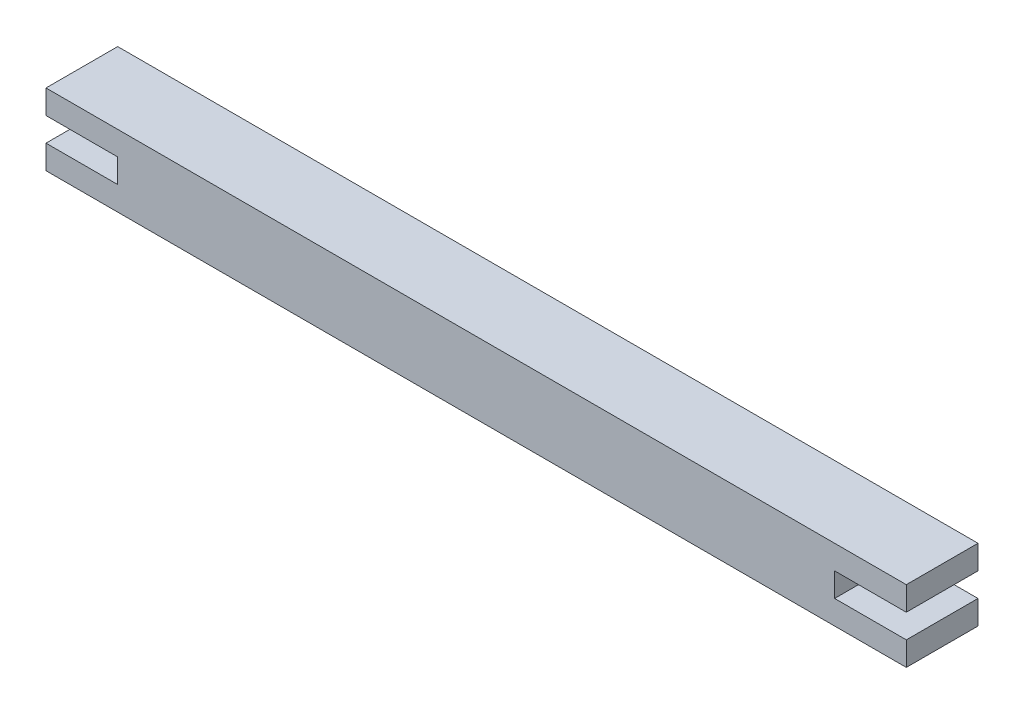
ISO-10303-21;
HEADER;
FILE_DESCRIPTION(('STEP AP214'),'2;1');
FILE_NAME('part.step','',(''),(''),'','','');
FILE_SCHEMA(('AUTOMOTIVE_DESIGN { 1 0 10303 214 1 1 1 1 }'));
ENDSEC;
DATA;
#1=APPLICATION_CONTEXT('core data for automotive mechanical design processes');
#2=APPLICATION_PROTOCOL_DEFINITION('international standard','automotive_design',2000,#1);
#3=PRODUCT_CONTEXT('',#1,'mechanical');
#4=PRODUCT('Part','Part','',(#3));
#5=PRODUCT_RELATED_PRODUCT_CATEGORY('part','',(#4));
#6=PRODUCT_DEFINITION_FORMATION('','',#4);
#7=PRODUCT_DEFINITION_CONTEXT('part definition',#1,'design');
#8=PRODUCT_DEFINITION('design','',#6,#7);
#9=PRODUCT_DEFINITION_SHAPE('','',#8);
#10=(LENGTH_UNIT() NAMED_UNIT(*) SI_UNIT(.MILLI.,.METRE.));
#11=(NAMED_UNIT(*) PLANE_ANGLE_UNIT() SI_UNIT($,.RADIAN.));
#12=(NAMED_UNIT(*) SI_UNIT($,.STERADIAN.) SOLID_ANGLE_UNIT());
#13=UNCERTAINTY_MEASURE_WITH_UNIT(LENGTH_MEASURE(1.E-05),#10,'distance_accuracy_value','');
#14=(GEOMETRIC_REPRESENTATION_CONTEXT(3) GLOBAL_UNCERTAINTY_ASSIGNED_CONTEXT((#13)) GLOBAL_UNIT_ASSIGNED_CONTEXT((#10,
#11,#12)) REPRESENTATION_CONTEXT('',''));
#15=CARTESIAN_POINT('',(0.,0.,0.));
#16=DIRECTION('',(0.,0.,1.));
#17=DIRECTION('',(1.,0.,0.));
#18=AXIS2_PLACEMENT_3D('',#15,#16,#17);
#19=CARTESIAN_POINT('',(150.,15.,-200.));
#20=DIRECTION('',(-1.,0.,0.));
#21=DIRECTION('',(0.,0.,1.));
#22=AXIS2_PLACEMENT_3D('',#19,#20,#21);
#23=PLANE('',#22);
#24=DIRECTION('',(0.,-1.,0.));
#25=VECTOR('',#24,1.);
#26=CARTESIAN_POINT('',(150.,15.,-200.));
#27=LINE('',#26,#25);
#28=CARTESIAN_POINT('',(150.,5.,-200.));
#29=VERTEX_POINT('',#28);
#30=CARTESIAN_POINT('',(150.,-5.,-200.));
#31=VERTEX_POINT('',#30);
#32=EDGE_CURVE('E207',#29,#31,#27,.T.);
#33=ORIENTED_EDGE('',*,*,#32,.T.);
#34=DIRECTION('',(0.,0.,-1.));
#35=VECTOR('',#34,1.);
#36=CARTESIAN_POINT('',(150.,-5.,-200.));
#37=LINE('',#36,#35);
#38=CARTESIAN_POINT('',(150.,-5.,-230.));
#39=VERTEX_POINT('',#38);
#40=EDGE_CURVE('E165',#31,#39,#37,.T.);
#41=ORIENTED_EDGE('',*,*,#40,.T.);
#42=DIRECTION('',(0.,-1.,0.));
#43=VECTOR('',#42,1.);
#44=CARTESIAN_POINT('',(150.,15.,-230.));
#45=LINE('',#44,#43);
#46=CARTESIAN_POINT('',(150.,5.,-230.));
#47=VERTEX_POINT('',#46);
#48=EDGE_CURVE('E11',#47,#39,#45,.T.);
#49=ORIENTED_EDGE('',*,*,#48,.F.);
#50=DIRECTION('',(0.,0.,1.));
#51=VECTOR('',#50,1.);
#52=CARTESIAN_POINT('',(150.,5.,-200.));
#53=LINE('',#52,#51);
#54=EDGE_CURVE('E201',#47,#29,#53,.T.);
#55=ORIENTED_EDGE('',*,*,#54,.T.);
#56=EDGE_LOOP('',(#33,#41,#49,#55));
#57=FACE_BOUND('',#56,.T.);
#58=ADVANCED_FACE('F33',(#57),#23,.F.);
#59=CARTESIAN_POINT('',(-150.,15.,-230.));
#60=DIRECTION('',(0.,0.,1.));
#61=DIRECTION('',(1.,0.,0.));
#62=AXIS2_PLACEMENT_3D('',#59,#60,#61);
#63=PLANE('',#62);
#64=ORIENTED_EDGE('',*,*,#48,.T.);
#65=DIRECTION('',(-1.,0.,0.));
#66=VECTOR('',#65,1.);
#67=CARTESIAN_POINT('',(-180.,-5.,-230.));
#68=LINE('',#67,#66);
#69=CARTESIAN_POINT('',(180.,-5.,-230.));
#70=VERTEX_POINT('',#69);
#71=EDGE_CURVE('E47',#70,#39,#68,.T.);
#72=ORIENTED_EDGE('',*,*,#71,.F.);
#73=DIRECTION('',(0.,1.,0.));
#74=VECTOR('',#73,1.);
#75=CARTESIAN_POINT('',(180.,-15.,-230.));
#76=LINE('',#75,#74);
#77=CARTESIAN_POINT('',(180.,-15.,-230.));
#78=VERTEX_POINT('',#77);
#79=EDGE_CURVE('E149',#78,#70,#76,.T.);
#80=ORIENTED_EDGE('',*,*,#79,.F.);
#81=DIRECTION('',(-1.,0.,0.));
#82=VECTOR('',#81,1.);
#83=CARTESIAN_POINT('',(-150.,-15.,-230.));
#84=LINE('',#83,#82);
#85=CARTESIAN_POINT('',(-180.,-15.,-230.));
#86=VERTEX_POINT('',#85);
#87=EDGE_CURVE('E136',#78,#86,#84,.T.);
#88=ORIENTED_EDGE('',*,*,#87,.T.);
#89=DIRECTION('',(0.,1.,0.));
#90=VECTOR('',#89,1.);
#91=CARTESIAN_POINT('',(-180.,-15.,-230.));
#92=LINE('',#91,#90);
#93=CARTESIAN_POINT('',(-180.,-5.,-230.));
#94=VERTEX_POINT('',#93);
#95=EDGE_CURVE('E160',#86,#94,#92,.T.);
#96=ORIENTED_EDGE('',*,*,#95,.T.);
#97=CARTESIAN_POINT('',(-150.,-5.,-230.));
#98=VERTEX_POINT('',#97);
#99=EDGE_CURVE('E151',#98,#94,#68,.T.);
#100=ORIENTED_EDGE('',*,*,#99,.F.);
#101=DIRECTION('',(0.,-1.,0.));
#102=VECTOR('',#101,1.);
#103=CARTESIAN_POINT('',(-150.,15.,-230.));
#104=LINE('',#103,#102);
#105=CARTESIAN_POINT('',(-150.,5.,-230.));
#106=VERTEX_POINT('',#105);
#107=EDGE_CURVE('E40',#106,#98,#104,.T.);
#108=ORIENTED_EDGE('',*,*,#107,.F.);
#109=DIRECTION('',(-1.,0.,0.));
#110=VECTOR('',#109,1.);
#111=CARTESIAN_POINT('',(-180.,5.,-230.));
#112=LINE('',#111,#110);
#113=CARTESIAN_POINT('',(-180.,5.,-230.));
#114=VERTEX_POINT('',#113);
#115=EDGE_CURVE('E178',#106,#114,#112,.T.);
#116=ORIENTED_EDGE('',*,*,#115,.T.);
#117=DIRECTION('',(0.,-1.,0.));
#118=VECTOR('',#117,1.);
#119=CARTESIAN_POINT('',(-180.,15.,-230.));
#120=LINE('',#119,#118);
#121=CARTESIAN_POINT('',(-180.,15.,-230.));
#122=VERTEX_POINT('',#121);
#123=EDGE_CURVE('E192',#122,#114,#120,.T.);
#124=ORIENTED_EDGE('',*,*,#123,.F.);
#125=DIRECTION('',(-1.,0.,0.));
#126=VECTOR('',#125,1.);
#127=CARTESIAN_POINT('',(-150.,15.,-230.));
#128=LINE('',#127,#126);
#129=CARTESIAN_POINT('',(180.,15.,-230.));
#130=VERTEX_POINT('',#129);
#131=EDGE_CURVE('E135',#130,#122,#128,.T.);
#132=ORIENTED_EDGE('',*,*,#131,.F.);
#133=DIRECTION('',(0.,-1.,0.));
#134=VECTOR('',#133,1.);
#135=CARTESIAN_POINT('',(180.,15.,-230.));
#136=LINE('',#135,#134);
#137=CARTESIAN_POINT('',(180.,5.,-230.));
#138=VERTEX_POINT('',#137);
#139=EDGE_CURVE('E195',#130,#138,#136,.T.);
#140=ORIENTED_EDGE('',*,*,#139,.T.);
#141=EDGE_CURVE('E179',#138,#47,#112,.T.);
#142=ORIENTED_EDGE('',*,*,#141,.T.);
#143=EDGE_LOOP('',(#64,#72,#80,#88,#96,#100,#108,#116,#124,#132,#140,#142));
#144=FACE_BOUND('',#143,.T.);
#145=ADVANCED_FACE('F219',(#144),#63,.F.);
#146=CARTESIAN_POINT('',(-150.,15.,-200.));
#147=DIRECTION('',(1.,0.,0.));
#148=DIRECTION('',(0.,0.,-1.));
#149=AXIS2_PLACEMENT_3D('',#146,#147,#148);
#150=PLANE('',#149);
#151=ORIENTED_EDGE('',*,*,#107,.T.);
#152=DIRECTION('',(0.,0.,1.));
#153=VECTOR('',#152,1.);
#154=CARTESIAN_POINT('',(-150.,-5.,-200.));
#155=LINE('',#154,#153);
#156=CARTESIAN_POINT('',(-150.,-5.,-200.));
#157=VERTEX_POINT('',#156);
#158=EDGE_CURVE('E143',#98,#157,#155,.T.);
#159=ORIENTED_EDGE('',*,*,#158,.T.);
#160=DIRECTION('',(0.,-1.,0.));
#161=VECTOR('',#160,1.);
#162=CARTESIAN_POINT('',(-150.,15.,-200.));
#163=LINE('',#162,#161);
#164=CARTESIAN_POINT('',(-150.,5.,-200.));
#165=VERTEX_POINT('',#164);
#166=EDGE_CURVE('E211',#165,#157,#163,.T.);
#167=ORIENTED_EDGE('',*,*,#166,.F.);
#168=DIRECTION('',(0.,0.,-1.));
#169=VECTOR('',#168,1.);
#170=CARTESIAN_POINT('',(-150.,5.,-200.));
#171=LINE('',#170,#169);
#172=EDGE_CURVE('E198',#165,#106,#171,.T.);
#173=ORIENTED_EDGE('',*,*,#172,.T.);
#174=EDGE_LOOP('',(#151,#159,#167,#173));
#175=FACE_BOUND('',#174,.T.);
#176=ADVANCED_FACE('F215',(#175),#150,.F.);
#177=CARTESIAN_POINT('',(-150.,15.,-200.));
#178=DIRECTION('',(0.,0.,-1.));
#179=DIRECTION('',(-1.,0.,0.));
#180=AXIS2_PLACEMENT_3D('',#177,#178,#179);
#181=PLANE('',#180);
#182=ORIENTED_EDGE('',*,*,#166,.T.);
#183=DIRECTION('',(1.,0.,0.));
#184=VECTOR('',#183,1.);
#185=CARTESIAN_POINT('',(-180.,-5.,-200.));
#186=LINE('',#185,#184);
#187=CARTESIAN_POINT('',(-180.,-5.,-200.));
#188=VERTEX_POINT('',#187);
#189=EDGE_CURVE('E55',#188,#157,#186,.T.);
#190=ORIENTED_EDGE('',*,*,#189,.F.);
#191=DIRECTION('',(0.,1.,0.));
#192=VECTOR('',#191,1.);
#193=CARTESIAN_POINT('',(-180.,-15.,-200.));
#194=LINE('',#193,#192);
#195=CARTESIAN_POINT('',(-180.,-15.,-200.));
#196=VERTEX_POINT('',#195);
#197=EDGE_CURVE('E130',#196,#188,#194,.T.);
#198=ORIENTED_EDGE('',*,*,#197,.F.);
#199=DIRECTION('',(1.,0.,0.));
#200=VECTOR('',#199,1.);
#201=CARTESIAN_POINT('',(-150.,-15.,-200.));
#202=LINE('',#201,#200);
#203=CARTESIAN_POINT('',(180.,-15.,-200.));
#204=VERTEX_POINT('',#203);
#205=EDGE_CURVE('E123',#196,#204,#202,.T.);
#206=ORIENTED_EDGE('',*,*,#205,.T.);
#207=DIRECTION('',(0.,1.,0.));
#208=VECTOR('',#207,1.);
#209=CARTESIAN_POINT('',(180.,-15.,-200.));
#210=LINE('',#209,#208);
#211=CARTESIAN_POINT('',(180.,-5.,-200.));
#212=VERTEX_POINT('',#211);
#213=EDGE_CURVE('E128',#204,#212,#210,.T.);
#214=ORIENTED_EDGE('',*,*,#213,.T.);
#215=EDGE_CURVE('E155',#31,#212,#186,.T.);
#216=ORIENTED_EDGE('',*,*,#215,.F.);
#217=ORIENTED_EDGE('',*,*,#32,.F.);
#218=DIRECTION('',(1.,0.,0.));
#219=VECTOR('',#218,1.);
#220=CARTESIAN_POINT('',(-180.,5.,-200.));
#221=LINE('',#220,#219);
#222=CARTESIAN_POINT('',(180.,5.,-200.));
#223=VERTEX_POINT('',#222);
#224=EDGE_CURVE('E184',#29,#223,#221,.T.);
#225=ORIENTED_EDGE('',*,*,#224,.T.);
#226=DIRECTION('',(0.,-1.,0.));
#227=VECTOR('',#226,1.);
#228=CARTESIAN_POINT('',(180.,15.,-200.));
#229=LINE('',#228,#227);
#230=CARTESIAN_POINT('',(180.,15.,-200.));
#231=VERTEX_POINT('',#230);
#232=EDGE_CURVE('E175',#231,#223,#229,.T.);
#233=ORIENTED_EDGE('',*,*,#232,.F.);
#234=DIRECTION('',(1.,0.,0.));
#235=VECTOR('',#234,1.);
#236=CARTESIAN_POINT('',(-150.,15.,-200.));
#237=LINE('',#236,#235);
#238=CARTESIAN_POINT('',(-180.,15.,-200.));
#239=VERTEX_POINT('',#238);
#240=EDGE_CURVE('E205',#239,#231,#237,.T.);
#241=ORIENTED_EDGE('',*,*,#240,.F.);
#242=DIRECTION('',(0.,-1.,0.));
#243=VECTOR('',#242,1.);
#244=CARTESIAN_POINT('',(-180.,15.,-200.));
#245=LINE('',#244,#243);
#246=CARTESIAN_POINT('',(-180.,5.,-200.));
#247=VERTEX_POINT('',#246);
#248=EDGE_CURVE('E189',#239,#247,#245,.T.);
#249=ORIENTED_EDGE('',*,*,#248,.T.);
#250=EDGE_CURVE('E172',#247,#165,#221,.T.);
#251=ORIENTED_EDGE('',*,*,#250,.T.);
#252=EDGE_LOOP('',(#182,#190,#198,#206,#214,#216,#217,#225,#233,#241,#249,#251));
#253=FACE_BOUND('',#252,.T.);
#254=ADVANCED_FACE('F126',(#253),#181,.F.);
#255=CARTESIAN_POINT('',(0.,15.,0.));
#256=DIRECTION('',(0.,-1.,0.));
#257=DIRECTION('',(0.,0.,-1.));
#258=AXIS2_PLACEMENT_3D('',#255,#256,#257);
#259=PLANE('',#258);
#260=ORIENTED_EDGE('',*,*,#240,.T.);
#261=DIRECTION('',(0.,0.,-1.));
#262=VECTOR('',#261,1.);
#263=CARTESIAN_POINT('',(180.,15.,-200.));
#264=LINE('',#263,#262);
#265=EDGE_CURVE('E168',#231,#130,#264,.T.);
#266=ORIENTED_EDGE('',*,*,#265,.T.);
#267=ORIENTED_EDGE('',*,*,#131,.T.);
#268=DIRECTION('',(0.,0.,1.));
#269=VECTOR('',#268,1.);
#270=CARTESIAN_POINT('',(-180.,15.,-200.));
#271=LINE('',#270,#269);
#272=EDGE_CURVE('E171',#122,#239,#271,.T.);
#273=ORIENTED_EDGE('',*,*,#272,.T.);
#274=EDGE_LOOP('',(#260,#266,#267,#273));
#275=FACE_BOUND('',#274,.T.);
#276=ADVANCED_FACE('F237',(#275),#259,.F.);
#277=CARTESIAN_POINT('',(0.,-15.,0.));
#278=DIRECTION('',(0.,-1.,0.));
#279=DIRECTION('',(0.,0.,-1.));
#280=AXIS2_PLACEMENT_3D('',#277,#278,#279);
#281=PLANE('',#280);
#282=ORIENTED_EDGE('',*,*,#87,.F.);
#283=DIRECTION('',(0.,0.,-1.));
#284=VECTOR('',#283,1.);
#285=CARTESIAN_POINT('',(180.,-15.,-200.));
#286=LINE('',#285,#284);
#287=EDGE_CURVE('E141',#204,#78,#286,.T.);
#288=ORIENTED_EDGE('',*,*,#287,.F.);
#289=ORIENTED_EDGE('',*,*,#205,.F.);
#290=DIRECTION('',(0.,0.,1.));
#291=VECTOR('',#290,1.);
#292=CARTESIAN_POINT('',(-180.,-15.,-200.));
#293=LINE('',#292,#291);
#294=EDGE_CURVE('E147',#86,#196,#293,.T.);
#295=ORIENTED_EDGE('',*,*,#294,.F.);
#296=EDGE_LOOP('',(#282,#288,#289,#295));
#297=FACE_BOUND('',#296,.T.);
#298=ADVANCED_FACE('F145',(#297),#281,.T.);
#299=CARTESIAN_POINT('',(-180.,15.,-200.));
#300=DIRECTION('',(1.,0.,0.));
#301=DIRECTION('',(0.,0.,-1.));
#302=AXIS2_PLACEMENT_3D('',#299,#300,#301);
#303=PLANE('',#302);
#304=DIRECTION('',(0.,0.,1.));
#305=VECTOR('',#304,1.);
#306=CARTESIAN_POINT('',(-180.,5.,-200.));
#307=LINE('',#306,#305);
#308=EDGE_CURVE('E182',#114,#247,#307,.T.);
#309=ORIENTED_EDGE('',*,*,#308,.T.);
#310=ORIENTED_EDGE('',*,*,#248,.F.);
#311=ORIENTED_EDGE('',*,*,#272,.F.);
#312=ORIENTED_EDGE('',*,*,#123,.T.);
#313=EDGE_LOOP('',(#309,#310,#311,#312));
#314=FACE_BOUND('',#313,.T.);
#315=ADVANCED_FACE('F232',(#314),#303,.F.);
#316=CARTESIAN_POINT('',(0.,5.,0.));
#317=DIRECTION('',(0.,-1.,0.));
#318=DIRECTION('',(0.,0.,-1.));
#319=AXIS2_PLACEMENT_3D('',#316,#317,#318);
#320=PLANE('',#319);
#321=ORIENTED_EDGE('',*,*,#172,.F.);
#322=ORIENTED_EDGE('',*,*,#250,.F.);
#323=ORIENTED_EDGE('',*,*,#308,.F.);
#324=ORIENTED_EDGE('',*,*,#115,.F.);
#325=EDGE_LOOP('',(#321,#322,#323,#324));
#326=FACE_BOUND('',#325,.T.);
#327=ADVANCED_FACE('F230',(#326),#320,.T.);
#328=ORIENTED_EDGE('',*,*,#54,.F.);
#329=ORIENTED_EDGE('',*,*,#141,.F.);
#330=DIRECTION('',(0.,0.,-1.));
#331=VECTOR('',#330,1.);
#332=CARTESIAN_POINT('',(180.,5.,-200.));
#333=LINE('',#332,#331);
#334=EDGE_CURVE('E167',#223,#138,#333,.T.);
#335=ORIENTED_EDGE('',*,*,#334,.F.);
#336=ORIENTED_EDGE('',*,*,#224,.F.);
#337=EDGE_LOOP('',(#328,#329,#335,#336));
#338=FACE_BOUND('',#337,.T.);
#339=ADVANCED_FACE('F243',(#338),#320,.T.);
#340=CARTESIAN_POINT('',(180.,15.,-200.));
#341=DIRECTION('',(-1.,0.,0.));
#342=DIRECTION('',(0.,0.,1.));
#343=AXIS2_PLACEMENT_3D('',#340,#341,#342);
#344=PLANE('',#343);
#345=ORIENTED_EDGE('',*,*,#334,.T.);
#346=ORIENTED_EDGE('',*,*,#139,.F.);
#347=ORIENTED_EDGE('',*,*,#265,.F.);
#348=ORIENTED_EDGE('',*,*,#232,.T.);
#349=EDGE_LOOP('',(#345,#346,#347,#348));
#350=FACE_BOUND('',#349,.T.);
#351=ADVANCED_FACE('F240',(#350),#344,.F.);
#352=CARTESIAN_POINT('',(-180.,-15.,-200.));
#353=DIRECTION('',(-1.,0.,0.));
#354=DIRECTION('',(0.,0.,1.));
#355=AXIS2_PLACEMENT_3D('',#352,#353,#354);
#356=PLANE('',#355);
#357=DIRECTION('',(0.,0.,1.));
#358=VECTOR('',#357,1.);
#359=CARTESIAN_POINT('',(-180.,-5.,-200.));
#360=LINE('',#359,#358);
#361=EDGE_CURVE('E157',#94,#188,#360,.T.);
#362=ORIENTED_EDGE('',*,*,#361,.F.);
#363=ORIENTED_EDGE('',*,*,#95,.F.);
#364=ORIENTED_EDGE('',*,*,#294,.T.);
#365=ORIENTED_EDGE('',*,*,#197,.T.);
#366=EDGE_LOOP('',(#362,#363,#364,#365));
#367=FACE_BOUND('',#366,.T.);
#368=ADVANCED_FACE('F225',(#367),#356,.T.);
#369=CARTESIAN_POINT('',(0.,-5.,0.));
#370=DIRECTION('',(0.,1.,0.));
#371=DIRECTION('',(0.,0.,-1.));
#372=AXIS2_PLACEMENT_3D('',#369,#370,#371);
#373=PLANE('',#372);
#374=ORIENTED_EDGE('',*,*,#158,.F.);
#375=ORIENTED_EDGE('',*,*,#99,.T.);
#376=ORIENTED_EDGE('',*,*,#361,.T.);
#377=ORIENTED_EDGE('',*,*,#189,.T.);
#378=EDGE_LOOP('',(#374,#375,#376,#377));
#379=FACE_BOUND('',#378,.T.);
#380=ADVANCED_FACE('F223',(#379),#373,.T.);
#381=ORIENTED_EDGE('',*,*,#40,.F.);
#382=ORIENTED_EDGE('',*,*,#215,.T.);
#383=DIRECTION('',(0.,0.,-1.));
#384=VECTOR('',#383,1.);
#385=CARTESIAN_POINT('',(180.,-5.,-200.));
#386=LINE('',#385,#384);
#387=EDGE_CURVE('E142',#212,#70,#386,.T.);
#388=ORIENTED_EDGE('',*,*,#387,.T.);
#389=ORIENTED_EDGE('',*,*,#71,.T.);
#390=EDGE_LOOP('',(#381,#382,#388,#389));
#391=FACE_BOUND('',#390,.T.);
#392=ADVANCED_FACE('F247',(#391),#373,.T.);
#393=CARTESIAN_POINT('',(180.,-15.,-200.));
#394=DIRECTION('',(1.,0.,0.));
#395=DIRECTION('',(0.,0.,-1.));
#396=AXIS2_PLACEMENT_3D('',#393,#394,#395);
#397=PLANE('',#396);
#398=ORIENTED_EDGE('',*,*,#387,.F.);
#399=ORIENTED_EDGE('',*,*,#213,.F.);
#400=ORIENTED_EDGE('',*,*,#287,.T.);
#401=ORIENTED_EDGE('',*,*,#79,.T.);
#402=EDGE_LOOP('',(#398,#399,#400,#401));
#403=FACE_BOUND('',#402,.T.);
#404=ADVANCED_FACE('F140',(#403),#397,.T.);
#405=CLOSED_SHELL('',(#58,#145,#176,#254,#276,#298,#315,#327,#339,#351,#368,#380,#392,#404));
#406=MANIFOLD_SOLID_BREP('B2',#405);
#407=ADVANCED_BREP_SHAPE_REPRESENTATION('',(#18,#406),#14);
#408=SHAPE_DEFINITION_REPRESENTATION(#9,#407);
ENDSEC;
END-ISO-10303-21;
